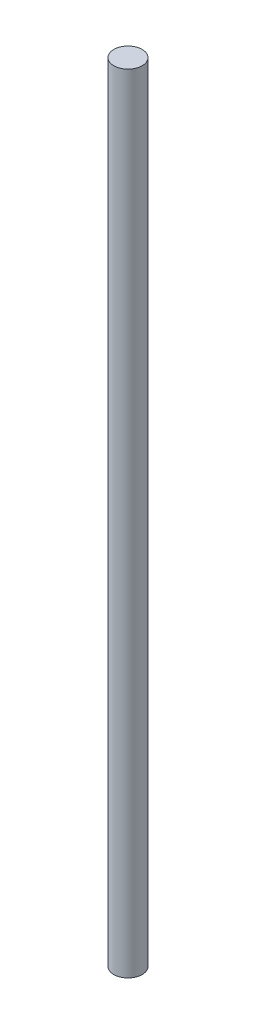
ISO-10303-21;
HEADER;
FILE_DESCRIPTION(('STEP AP214'),'2;1');
FILE_NAME('part.step','',(''),(''),'','','');
FILE_SCHEMA(('AUTOMOTIVE_DESIGN { 1 0 10303 214 1 1 1 1 }'));
ENDSEC;
DATA;
#1=APPLICATION_CONTEXT('core data for automotive mechanical design processes');
#2=APPLICATION_PROTOCOL_DEFINITION('international standard','automotive_design',2000,#1);
#3=PRODUCT_CONTEXT('',#1,'mechanical');
#4=PRODUCT('Part','Part','',(#3));
#5=PRODUCT_RELATED_PRODUCT_CATEGORY('part','',(#4));
#6=PRODUCT_DEFINITION_FORMATION('','',#4);
#7=PRODUCT_DEFINITION_CONTEXT('part definition',#1,'design');
#8=PRODUCT_DEFINITION('design','',#6,#7);
#9=PRODUCT_DEFINITION_SHAPE('','',#8);
#10=(LENGTH_UNIT() NAMED_UNIT(*) SI_UNIT(.MILLI.,.METRE.));
#11=(NAMED_UNIT(*) PLANE_ANGLE_UNIT() SI_UNIT($,.RADIAN.));
#12=(NAMED_UNIT(*) SI_UNIT($,.STERADIAN.) SOLID_ANGLE_UNIT());
#13=UNCERTAINTY_MEASURE_WITH_UNIT(LENGTH_MEASURE(1.E-05),#10,'distance_accuracy_value','');
#14=(GEOMETRIC_REPRESENTATION_CONTEXT(3) GLOBAL_UNCERTAINTY_ASSIGNED_CONTEXT((#13)) GLOBAL_UNIT_ASSIGNED_CONTEXT((#10,
#11,#12)) REPRESENTATION_CONTEXT('',''));
#15=CARTESIAN_POINT('',(0.,0.,0.));
#16=DIRECTION('',(0.,0.,1.));
#17=DIRECTION('',(1.,0.,0.));
#18=AXIS2_PLACEMENT_3D('',#15,#16,#17);
#19=CARTESIAN_POINT('',(0.,200.,0.));
#20=DIRECTION('',(0.,-1.,0.));
#21=DIRECTION('',(0.,0.,-1.));
#22=AXIS2_PLACEMENT_3D('',#19,#20,#21);
#23=CYLINDRICAL_SURFACE('',#22,3.6);
#24=CARTESIAN_POINT('',(0.,200.,0.));
#25=DIRECTION('',(0.,1.,0.));
#26=DIRECTION('',(0.,0.,1.));
#27=AXIS2_PLACEMENT_3D('',#24,#25,#26);
#28=CIRCLE('',#27,3.6);
#29=CARTESIAN_POINT('',(0.,200.,3.6));
#30=VERTEX_POINT('',#29);
#31=EDGE_CURVE('E10',#30,#30,#28,.T.);
#32=ORIENTED_EDGE('',*,*,#31,.F.);
#33=EDGE_LOOP('',(#32));
#34=FACE_BOUND('',#33,.T.);
#35=CARTESIAN_POINT('',(0.,0.,0.));
#36=DIRECTION('',(0.,1.,0.));
#37=DIRECTION('',(0.,0.,1.));
#38=AXIS2_PLACEMENT_3D('',#35,#36,#37);
#39=CIRCLE('',#38,3.6);
#40=CARTESIAN_POINT('',(0.,0.,3.6));
#41=VERTEX_POINT('',#40);
#42=EDGE_CURVE('E44',#41,#41,#39,.T.);
#43=ORIENTED_EDGE('',*,*,#42,.T.);
#44=EDGE_LOOP('',(#43));
#45=FACE_BOUND('',#44,.T.);
#46=ADVANCED_FACE('F41',(#34,#45),#23,.T.);
#47=CARTESIAN_POINT('',(0.,200.,0.));
#48=DIRECTION('',(0.,1.,0.));
#49=DIRECTION('',(0.,0.,1.));
#50=AXIS2_PLACEMENT_3D('',#47,#48,#49);
#51=PLANE('',#50);
#52=ORIENTED_EDGE('',*,*,#31,.T.);
#53=EDGE_LOOP('',(#52));
#54=FACE_BOUND('',#53,.T.);
#55=ADVANCED_FACE('F58',(#54),#51,.T.);
#56=CARTESIAN_POINT('',(0.,0.,0.));
#57=DIRECTION('',(0.,1.,0.));
#58=DIRECTION('',(0.,0.,1.));
#59=AXIS2_PLACEMENT_3D('',#56,#57,#58);
#60=PLANE('',#59);
#61=ORIENTED_EDGE('',*,*,#42,.F.);
#62=EDGE_LOOP('',(#61));
#63=FACE_BOUND('',#62,.T.);
#64=ADVANCED_FACE('F56',(#63),#60,.F.);
#65=CLOSED_SHELL('',(#46,#55,#64));
#66=MANIFOLD_SOLID_BREP('B2',#65);
#67=ADVANCED_BREP_SHAPE_REPRESENTATION('',(#18,#66),#14);
#68=SHAPE_DEFINITION_REPRESENTATION(#9,#67);
ENDSEC;
END-ISO-10303-21;
